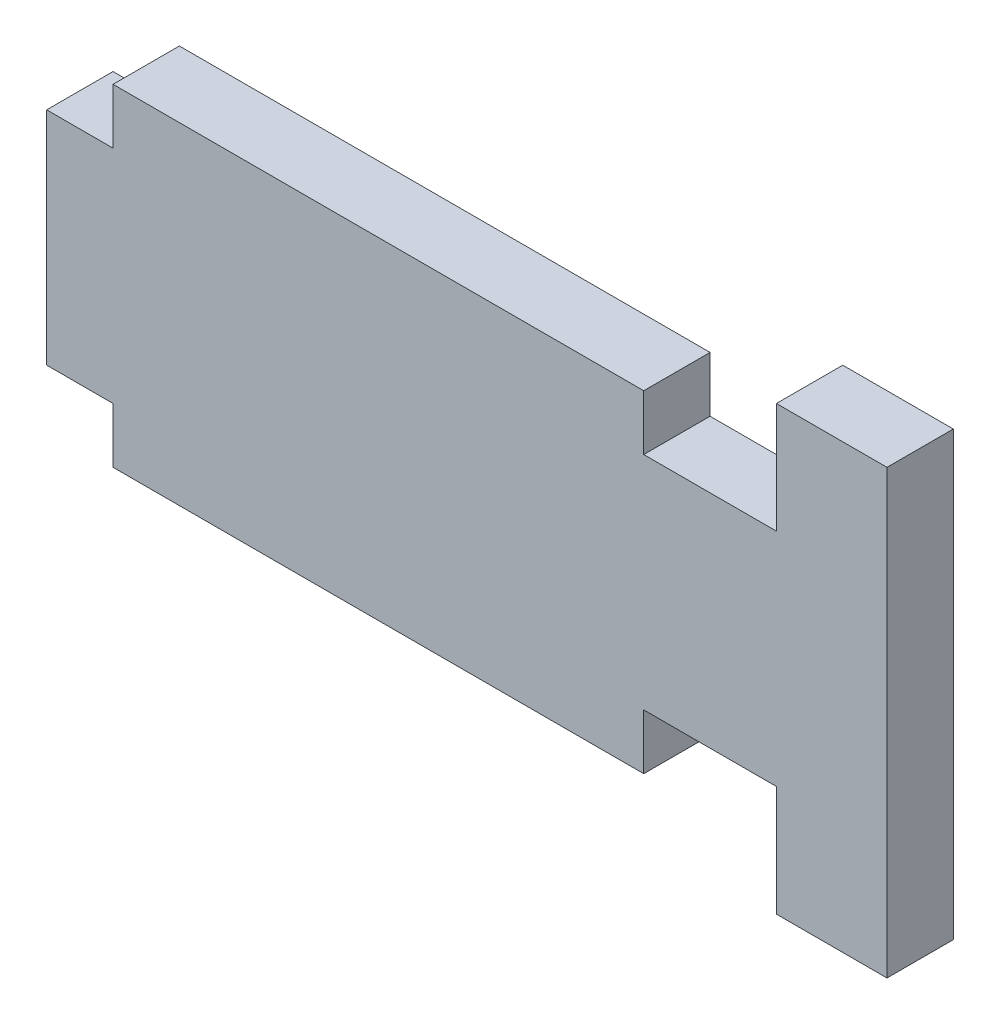
ISO-10303-21;
HEADER;
FILE_DESCRIPTION(('STEP AP214'),'2;1');
FILE_NAME('part.step','',(''),(''),'','','');
FILE_SCHEMA(('AUTOMOTIVE_DESIGN { 1 0 10303 214 1 1 1 1 }'));
ENDSEC;
DATA;
#1=APPLICATION_CONTEXT('core data for automotive mechanical design processes');
#2=APPLICATION_PROTOCOL_DEFINITION('international standard','automotive_design',2000,#1);
#3=PRODUCT_CONTEXT('',#1,'mechanical');
#4=PRODUCT('Part','Part','',(#3));
#5=PRODUCT_RELATED_PRODUCT_CATEGORY('part','',(#4));
#6=PRODUCT_DEFINITION_FORMATION('','',#4);
#7=PRODUCT_DEFINITION_CONTEXT('part definition',#1,'design');
#8=PRODUCT_DEFINITION('design','',#6,#7);
#9=PRODUCT_DEFINITION_SHAPE('','',#8);
#10=(LENGTH_UNIT() NAMED_UNIT(*) SI_UNIT(.MILLI.,.METRE.));
#11=(NAMED_UNIT(*) PLANE_ANGLE_UNIT() SI_UNIT($,.RADIAN.));
#12=(NAMED_UNIT(*) SI_UNIT($,.STERADIAN.) SOLID_ANGLE_UNIT());
#13=UNCERTAINTY_MEASURE_WITH_UNIT(LENGTH_MEASURE(1.E-05),#10,'distance_accuracy_value','');
#14=(GEOMETRIC_REPRESENTATION_CONTEXT(3) GLOBAL_UNCERTAINTY_ASSIGNED_CONTEXT((#13)) GLOBAL_UNIT_ASSIGNED_CONTEXT((#10,
#11,#12)) REPRESENTATION_CONTEXT('',''));
#15=CARTESIAN_POINT('',(0.,0.,0.));
#16=DIRECTION('',(0.,0.,1.));
#17=DIRECTION('',(1.,0.,0.));
#18=AXIS2_PLACEMENT_3D('',#15,#16,#17);
#19=CARTESIAN_POINT('',(0.,0.,0.));
#20=DIRECTION('',(0.,0.,1.));
#21=DIRECTION('',(1.,0.,0.));
#22=AXIS2_PLACEMENT_3D('',#19,#20,#21);
#23=PLANE('',#22);
#24=DIRECTION('',(1.,0.,0.));
#25=VECTOR('',#24,1.);
#26=CARTESIAN_POINT('',(0.,5.,0.));
#27=LINE('',#26,#25);
#28=CARTESIAN_POINT('',(-15.,5.,0.));
#29=VERTEX_POINT('',#28);
#30=CARTESIAN_POINT('',(-12.,5.,0.));
#31=VERTEX_POINT('',#30);
#32=EDGE_CURVE('E244',#29,#31,#27,.T.);
#33=ORIENTED_EDGE('',*,*,#32,.T.);
#34=DIRECTION('',(0.,1.,0.));
#35=VECTOR('',#34,1.);
#36=CARTESIAN_POINT('',(-12.,0.,0.));
#37=LINE('',#36,#35);
#38=CARTESIAN_POINT('',(-12.,7.5,0.));
#39=VERTEX_POINT('',#38);
#40=EDGE_CURVE('E256',#31,#39,#37,.T.);
#41=ORIENTED_EDGE('',*,*,#40,.T.);
#42=DIRECTION('',(1.,0.,0.));
#43=VECTOR('',#42,1.);
#44=CARTESIAN_POINT('',(0.,7.5,0.));
#45=LINE('',#44,#43);
#46=CARTESIAN_POINT('',(12.,7.5,0.));
#47=VERTEX_POINT('',#46);
#48=EDGE_CURVE('E279',#39,#47,#45,.T.);
#49=ORIENTED_EDGE('',*,*,#48,.T.);
#50=DIRECTION('',(0.,1.,0.));
#51=VECTOR('',#50,1.);
#52=CARTESIAN_POINT('',(12.,0.,0.));
#53=LINE('',#52,#51);
#54=CARTESIAN_POINT('',(12.,5.,0.));
#55=VERTEX_POINT('',#54);
#56=EDGE_CURVE('E231',#55,#47,#53,.T.);
#57=ORIENTED_EDGE('',*,*,#56,.F.);
#58=DIRECTION('',(-1.,0.,0.));
#59=VECTOR('',#58,1.);
#60=CARTESIAN_POINT('',(0.,5.00000000000001,0.));
#61=LINE('',#60,#59);
#62=CARTESIAN_POINT('',(18.,5.,0.));
#63=VERTEX_POINT('',#62);
#64=EDGE_CURVE('E277',#63,#55,#61,.T.);
#65=ORIENTED_EDGE('',*,*,#64,.F.);
#66=DIRECTION('',(0.,1.,0.));
#67=VECTOR('',#66,1.);
#68=CARTESIAN_POINT('',(18.,0.,0.));
#69=LINE('',#68,#67);
#70=CARTESIAN_POINT('',(18.,10.,0.));
#71=VERTEX_POINT('',#70);
#72=EDGE_CURVE('E268',#63,#71,#69,.T.);
#73=ORIENTED_EDGE('',*,*,#72,.T.);
#74=DIRECTION('',(1.,0.,0.));
#75=VECTOR('',#74,1.);
#76=CARTESIAN_POINT('',(0.,10.,0.));
#77=LINE('',#76,#75);
#78=CARTESIAN_POINT('',(23.,10.,0.));
#79=VERTEX_POINT('',#78);
#80=EDGE_CURVE('E274',#71,#79,#77,.T.);
#81=ORIENTED_EDGE('',*,*,#80,.T.);
#82=DIRECTION('',(0.,-1.,0.));
#83=VECTOR('',#82,1.);
#84=CARTESIAN_POINT('',(23.,0.,0.));
#85=LINE('',#84,#83);
#86=CARTESIAN_POINT('',(23.,-10.,0.));
#87=VERTEX_POINT('',#86);
#88=EDGE_CURVE('E271',#79,#87,#85,.T.);
#89=ORIENTED_EDGE('',*,*,#88,.T.);
#90=DIRECTION('',(-1.,0.,0.));
#91=VECTOR('',#90,1.);
#92=CARTESIAN_POINT('',(0.,-10.,0.));
#93=LINE('',#92,#91);
#94=CARTESIAN_POINT('',(18.,-10.,0.));
#95=VERTEX_POINT('',#94);
#96=EDGE_CURVE('E267',#87,#95,#93,.T.);
#97=ORIENTED_EDGE('',*,*,#96,.T.);
#98=CARTESIAN_POINT('',(18.,-5.,0.));
#99=VERTEX_POINT('',#98);
#100=EDGE_CURVE('E264',#95,#99,#69,.T.);
#101=ORIENTED_EDGE('',*,*,#100,.T.);
#102=DIRECTION('',(-1.,0.,0.));
#103=VECTOR('',#102,1.);
#104=CARTESIAN_POINT('',(0.,-4.99999999999999,0.));
#105=LINE('',#104,#103);
#106=CARTESIAN_POINT('',(12.,-5.,0.));
#107=VERTEX_POINT('',#106);
#108=EDGE_CURVE('E261',#99,#107,#105,.T.);
#109=ORIENTED_EDGE('',*,*,#108,.T.);
#110=CARTESIAN_POINT('',(12.,-7.5,0.));
#111=VERTEX_POINT('',#110);
#112=EDGE_CURVE('E258',#111,#107,#53,.T.);
#113=ORIENTED_EDGE('',*,*,#112,.F.);
#114=DIRECTION('',(1.,0.,0.));
#115=VECTOR('',#114,1.);
#116=CARTESIAN_POINT('',(0.,-7.5,0.));
#117=LINE('',#116,#115);
#118=CARTESIAN_POINT('',(-12.,-7.5,0.));
#119=VERTEX_POINT('',#118);
#120=EDGE_CURVE('E255',#119,#111,#117,.T.);
#121=ORIENTED_EDGE('',*,*,#120,.F.);
#122=CARTESIAN_POINT('',(-12.,-5.,0.));
#123=VERTEX_POINT('',#122);
#124=EDGE_CURVE('E252',#119,#123,#37,.T.);
#125=ORIENTED_EDGE('',*,*,#124,.T.);
#126=DIRECTION('',(1.,0.,0.));
#127=VECTOR('',#126,1.);
#128=CARTESIAN_POINT('',(0.,-5.,0.));
#129=LINE('',#128,#127);
#130=CARTESIAN_POINT('',(-15.,-5.,0.));
#131=VERTEX_POINT('',#130);
#132=EDGE_CURVE('E249',#131,#123,#129,.T.);
#133=ORIENTED_EDGE('',*,*,#132,.F.);
#134=DIRECTION('',(0.,1.,0.));
#135=VECTOR('',#134,1.);
#136=CARTESIAN_POINT('',(-15.,0.,0.));
#137=LINE('',#136,#135);
#138=EDGE_CURVE('E246',#131,#29,#137,.T.);
#139=ORIENTED_EDGE('',*,*,#138,.T.);
#140=EDGE_LOOP('',(#33,#41,#49,#57,#65,#73,#81,#89,#97,#101,#109,#113,#121,#125,#133,#139));
#141=FACE_BOUND('',#140,.T.);
#142=ADVANCED_FACE('F97',(#141),#23,.F.);
#143=CARTESIAN_POINT('',(0.,-5.,3.));
#144=DIRECTION('',(0.,1.,0.));
#145=DIRECTION('',(0.,0.,1.));
#146=AXIS2_PLACEMENT_3D('',#143,#144,#145);
#147=PLANE('',#146);
#148=ORIENTED_EDGE('',*,*,#132,.T.);
#149=DIRECTION('',(0.,0.,-1.));
#150=VECTOR('',#149,1.);
#151=CARTESIAN_POINT('',(-12.,-5.,3.));
#152=LINE('',#151,#150);
#153=CARTESIAN_POINT('',(-12.,-5.,3.));
#154=VERTEX_POINT('',#153);
#155=EDGE_CURVE('E303',#154,#123,#152,.T.);
#156=ORIENTED_EDGE('',*,*,#155,.F.);
#157=DIRECTION('',(1.,0.,0.));
#158=VECTOR('',#157,1.);
#159=CARTESIAN_POINT('',(0.,-5.,3.));
#160=LINE('',#159,#158);
#161=CARTESIAN_POINT('',(-15.,-5.,3.));
#162=VERTEX_POINT('',#161);
#163=EDGE_CURVE('E308',#162,#154,#160,.T.);
#164=ORIENTED_EDGE('',*,*,#163,.F.);
#165=DIRECTION('',(0.,0.,-1.));
#166=VECTOR('',#165,1.);
#167=CARTESIAN_POINT('',(-15.,-5.,3.));
#168=LINE('',#167,#166);
#169=EDGE_CURVE('E106',#162,#131,#168,.T.);
#170=ORIENTED_EDGE('',*,*,#169,.T.);
#171=EDGE_LOOP('',(#148,#156,#164,#170));
#172=FACE_BOUND('',#171,.T.);
#173=ADVANCED_FACE('F307',(#172),#147,.F.);
#174=CARTESIAN_POINT('',(-15.,0.,3.));
#175=DIRECTION('',(-1.,0.,0.));
#176=DIRECTION('',(0.,0.,1.));
#177=AXIS2_PLACEMENT_3D('',#174,#175,#176);
#178=PLANE('',#177);
#179=ORIENTED_EDGE('',*,*,#138,.F.);
#180=ORIENTED_EDGE('',*,*,#169,.F.);
#181=DIRECTION('',(0.,1.,0.));
#182=VECTOR('',#181,1.);
#183=CARTESIAN_POINT('',(-15.,0.,3.));
#184=LINE('',#183,#182);
#185=CARTESIAN_POINT('',(-15.,5.,3.));
#186=VERTEX_POINT('',#185);
#187=EDGE_CURVE('E317',#162,#186,#184,.T.);
#188=ORIENTED_EDGE('',*,*,#187,.T.);
#189=DIRECTION('',(0.,0.,-1.));
#190=VECTOR('',#189,1.);
#191=CARTESIAN_POINT('',(-15.,5.,3.));
#192=LINE('',#191,#190);
#193=EDGE_CURVE('E12',#186,#29,#192,.T.);
#194=ORIENTED_EDGE('',*,*,#193,.T.);
#195=EDGE_LOOP('',(#179,#180,#188,#194));
#196=FACE_BOUND('',#195,.T.);
#197=ADVANCED_FACE('F316',(#196),#178,.T.);
#198=CARTESIAN_POINT('',(0.,5.,3.));
#199=DIRECTION('',(0.,1.,0.));
#200=DIRECTION('',(0.,0.,1.));
#201=AXIS2_PLACEMENT_3D('',#198,#199,#200);
#202=PLANE('',#201);
#203=ORIENTED_EDGE('',*,*,#32,.F.);
#204=ORIENTED_EDGE('',*,*,#193,.F.);
#205=DIRECTION('',(1.,0.,0.));
#206=VECTOR('',#205,1.);
#207=CARTESIAN_POINT('',(0.,5.,3.));
#208=LINE('',#207,#206);
#209=CARTESIAN_POINT('',(-12.,5.,3.));
#210=VERTEX_POINT('',#209);
#211=EDGE_CURVE('E320',#186,#210,#208,.T.);
#212=ORIENTED_EDGE('',*,*,#211,.T.);
#213=DIRECTION('',(0.,0.,-1.));
#214=VECTOR('',#213,1.);
#215=CARTESIAN_POINT('',(-12.,5.,3.));
#216=LINE('',#215,#214);
#217=EDGE_CURVE('E114',#210,#31,#216,.T.);
#218=ORIENTED_EDGE('',*,*,#217,.T.);
#219=EDGE_LOOP('',(#203,#204,#212,#218));
#220=FACE_BOUND('',#219,.T.);
#221=ADVANCED_FACE('F99',(#220),#202,.T.);
#222=CARTESIAN_POINT('',(0.,0.,3.));
#223=DIRECTION('',(0.,0.,1.));
#224=DIRECTION('',(1.,0.,0.));
#225=AXIS2_PLACEMENT_3D('',#222,#223,#224);
#226=PLANE('',#225);
#227=ORIENTED_EDGE('',*,*,#163,.T.);
#228=DIRECTION('',(0.,1.,0.));
#229=VECTOR('',#228,1.);
#230=CARTESIAN_POINT('',(-12.,0.,3.));
#231=LINE('',#230,#229);
#232=CARTESIAN_POINT('',(-12.,-7.5,3.));
#233=VERTEX_POINT('',#232);
#234=EDGE_CURVE('E240',#233,#154,#231,.T.);
#235=ORIENTED_EDGE('',*,*,#234,.F.);
#236=DIRECTION('',(1.,0.,0.));
#237=VECTOR('',#236,1.);
#238=CARTESIAN_POINT('',(0.,-7.5,3.));
#239=LINE('',#238,#237);
#240=CARTESIAN_POINT('',(12.,-7.5,3.));
#241=VERTEX_POINT('',#240);
#242=EDGE_CURVE('E326',#233,#241,#239,.T.);
#243=ORIENTED_EDGE('',*,*,#242,.T.);
#244=DIRECTION('',(0.,1.,0.));
#245=VECTOR('',#244,1.);
#246=CARTESIAN_POINT('',(12.,0.,3.));
#247=LINE('',#246,#245);
#248=CARTESIAN_POINT('',(12.,-5.,3.));
#249=VERTEX_POINT('',#248);
#250=EDGE_CURVE('E226',#241,#249,#247,.T.);
#251=ORIENTED_EDGE('',*,*,#250,.T.);
#252=DIRECTION('',(-1.,0.,0.));
#253=VECTOR('',#252,1.);
#254=CARTESIAN_POINT('',(0.,-4.99999999999999,3.));
#255=LINE('',#254,#253);
#256=CARTESIAN_POINT('',(18.,-5.,3.));
#257=VERTEX_POINT('',#256);
#258=EDGE_CURVE('E328',#257,#249,#255,.T.);
#259=ORIENTED_EDGE('',*,*,#258,.F.);
#260=DIRECTION('',(0.,1.,0.));
#261=VECTOR('',#260,1.);
#262=CARTESIAN_POINT('',(18.,0.,3.));
#263=LINE('',#262,#261);
#264=CARTESIAN_POINT('',(18.,-10.,3.));
#265=VERTEX_POINT('',#264);
#266=EDGE_CURVE('E331',#265,#257,#263,.T.);
#267=ORIENTED_EDGE('',*,*,#266,.F.);
#268=DIRECTION('',(-1.,0.,0.));
#269=VECTOR('',#268,1.);
#270=CARTESIAN_POINT('',(0.,-10.,3.));
#271=LINE('',#270,#269);
#272=CARTESIAN_POINT('',(23.,-10.,3.));
#273=VERTEX_POINT('',#272);
#274=EDGE_CURVE('E334',#273,#265,#271,.T.);
#275=ORIENTED_EDGE('',*,*,#274,.F.);
#276=DIRECTION('',(0.,-1.,0.));
#277=VECTOR('',#276,1.);
#278=CARTESIAN_POINT('',(23.,0.,3.));
#279=LINE('',#278,#277);
#280=CARTESIAN_POINT('',(23.,10.,3.));
#281=VERTEX_POINT('',#280);
#282=EDGE_CURVE('E338',#281,#273,#279,.T.);
#283=ORIENTED_EDGE('',*,*,#282,.F.);
#284=DIRECTION('',(1.,0.,0.));
#285=VECTOR('',#284,1.);
#286=CARTESIAN_POINT('',(0.,10.,3.));
#287=LINE('',#286,#285);
#288=CARTESIAN_POINT('',(18.,10.,3.));
#289=VERTEX_POINT('',#288);
#290=EDGE_CURVE('E340',#289,#281,#287,.T.);
#291=ORIENTED_EDGE('',*,*,#290,.F.);
#292=CARTESIAN_POINT('',(18.,5.,3.));
#293=VERTEX_POINT('',#292);
#294=EDGE_CURVE('E335',#293,#289,#263,.T.);
#295=ORIENTED_EDGE('',*,*,#294,.F.);
#296=DIRECTION('',(-1.,0.,0.));
#297=VECTOR('',#296,1.);
#298=CARTESIAN_POINT('',(0.,5.00000000000001,3.));
#299=LINE('',#298,#297);
#300=CARTESIAN_POINT('',(12.,5.,3.));
#301=VERTEX_POINT('',#300);
#302=EDGE_CURVE('E221',#293,#301,#299,.T.);
#303=ORIENTED_EDGE('',*,*,#302,.T.);
#304=CARTESIAN_POINT('',(12.,7.5,3.));
#305=VERTEX_POINT('',#304);
#306=EDGE_CURVE('E212',#301,#305,#247,.T.);
#307=ORIENTED_EDGE('',*,*,#306,.T.);
#308=DIRECTION('',(1.,0.,0.));
#309=VECTOR('',#308,1.);
#310=CARTESIAN_POINT('',(0.,7.5,3.));
#311=LINE('',#310,#309);
#312=CARTESIAN_POINT('',(-12.,7.5,3.));
#313=VERTEX_POINT('',#312);
#314=EDGE_CURVE('E218',#313,#305,#311,.T.);
#315=ORIENTED_EDGE('',*,*,#314,.F.);
#316=EDGE_CURVE('E237',#210,#313,#231,.T.);
#317=ORIENTED_EDGE('',*,*,#316,.F.);
#318=ORIENTED_EDGE('',*,*,#211,.F.);
#319=ORIENTED_EDGE('',*,*,#187,.F.);
#320=EDGE_LOOP('',(#227,#235,#243,#251,#259,#267,#275,#283,#291,#295,#303,#307,#315,#317,#318,#319));
#321=FACE_BOUND('',#320,.T.);
#322=ADVANCED_FACE('F215',(#321),#226,.T.);
#323=CARTESIAN_POINT('',(-12.,0.,3.));
#324=DIRECTION('',(-1.,0.,0.));
#325=DIRECTION('',(0.,0.,1.));
#326=AXIS2_PLACEMENT_3D('',#323,#324,#325);
#327=PLANE('',#326);
#328=ORIENTED_EDGE('',*,*,#124,.F.);
#329=DIRECTION('',(0.,0.,-1.));
#330=VECTOR('',#329,1.);
#331=CARTESIAN_POINT('',(-12.,-7.5,3.));
#332=LINE('',#331,#330);
#333=EDGE_CURVE('E301',#233,#119,#332,.T.);
#334=ORIENTED_EDGE('',*,*,#333,.F.);
#335=ORIENTED_EDGE('',*,*,#234,.T.);
#336=ORIENTED_EDGE('',*,*,#155,.T.);
#337=EDGE_LOOP('',(#328,#334,#335,#336));
#338=FACE_BOUND('',#337,.T.);
#339=ADVANCED_FACE('F373',(#338),#327,.T.);
#340=CARTESIAN_POINT('',(0.,-7.5,3.));
#341=DIRECTION('',(0.,1.,0.));
#342=DIRECTION('',(0.,0.,1.));
#343=AXIS2_PLACEMENT_3D('',#340,#341,#342);
#344=PLANE('',#343);
#345=ORIENTED_EDGE('',*,*,#120,.T.);
#346=DIRECTION('',(0.,0.,-1.));
#347=VECTOR('',#346,1.);
#348=CARTESIAN_POINT('',(12.,-7.5,3.));
#349=LINE('',#348,#347);
#350=EDGE_CURVE('E298',#241,#111,#349,.T.);
#351=ORIENTED_EDGE('',*,*,#350,.F.);
#352=ORIENTED_EDGE('',*,*,#242,.F.);
#353=ORIENTED_EDGE('',*,*,#333,.T.);
#354=EDGE_LOOP('',(#345,#351,#352,#353));
#355=FACE_BOUND('',#354,.T.);
#356=ADVANCED_FACE('F381',(#355),#344,.F.);
#357=CARTESIAN_POINT('',(12.,0.,3.));
#358=DIRECTION('',(-1.,0.,0.));
#359=DIRECTION('',(0.,0.,1.));
#360=AXIS2_PLACEMENT_3D('',#357,#358,#359);
#361=PLANE('',#360);
#362=ORIENTED_EDGE('',*,*,#112,.T.);
#363=DIRECTION('',(0.,0.,-1.));
#364=VECTOR('',#363,1.);
#365=CARTESIAN_POINT('',(12.,-5.,3.));
#366=LINE('',#365,#364);
#367=EDGE_CURVE('E296',#249,#107,#366,.T.);
#368=ORIENTED_EDGE('',*,*,#367,.F.);
#369=ORIENTED_EDGE('',*,*,#250,.F.);
#370=ORIENTED_EDGE('',*,*,#350,.T.);
#371=EDGE_LOOP('',(#362,#368,#369,#370));
#372=FACE_BOUND('',#371,.T.);
#373=ADVANCED_FACE('F368',(#372),#361,.F.);
#374=CARTESIAN_POINT('',(0.,-4.99999999999999,3.));
#375=DIRECTION('',(0.,-1.,0.));
#376=DIRECTION('',(1.,0.,0.));
#377=AXIS2_PLACEMENT_3D('',#374,#375,#376);
#378=PLANE('',#377);
#379=ORIENTED_EDGE('',*,*,#108,.F.);
#380=DIRECTION('',(0.,0.,-1.));
#381=VECTOR('',#380,1.);
#382=CARTESIAN_POINT('',(18.,-5.,3.));
#383=LINE('',#382,#381);
#384=EDGE_CURVE('E294',#257,#99,#383,.T.);
#385=ORIENTED_EDGE('',*,*,#384,.F.);
#386=ORIENTED_EDGE('',*,*,#258,.T.);
#387=ORIENTED_EDGE('',*,*,#367,.T.);
#388=EDGE_LOOP('',(#379,#385,#386,#387));
#389=FACE_BOUND('',#388,.T.);
#390=ADVANCED_FACE('F448',(#389),#378,.T.);
#391=CARTESIAN_POINT('',(18.,0.,3.));
#392=DIRECTION('',(-1.,0.,0.));
#393=DIRECTION('',(0.,0.,1.));
#394=AXIS2_PLACEMENT_3D('',#391,#392,#393);
#395=PLANE('',#394);
#396=ORIENTED_EDGE('',*,*,#100,.F.);
#397=DIRECTION('',(0.,0.,-1.));
#398=VECTOR('',#397,1.);
#399=CARTESIAN_POINT('',(18.,-10.,3.));
#400=LINE('',#399,#398);
#401=EDGE_CURVE('E292',#265,#95,#400,.T.);
#402=ORIENTED_EDGE('',*,*,#401,.F.);
#403=ORIENTED_EDGE('',*,*,#266,.T.);
#404=ORIENTED_EDGE('',*,*,#384,.T.);
#405=EDGE_LOOP('',(#396,#402,#403,#404));
#406=FACE_BOUND('',#405,.T.);
#407=ADVANCED_FACE('F370',(#406),#395,.T.);
#408=CARTESIAN_POINT('',(0.,-10.,3.));
#409=DIRECTION('',(0.,-1.,0.));
#410=DIRECTION('',(0.,0.,-1.));
#411=AXIS2_PLACEMENT_3D('',#408,#409,#410);
#412=PLANE('',#411);
#413=ORIENTED_EDGE('',*,*,#96,.F.);
#414=DIRECTION('',(0.,0.,-1.));
#415=VECTOR('',#414,1.);
#416=CARTESIAN_POINT('',(23.,-10.,3.));
#417=LINE('',#416,#415);
#418=EDGE_CURVE('E290',#273,#87,#417,.T.);
#419=ORIENTED_EDGE('',*,*,#418,.F.);
#420=ORIENTED_EDGE('',*,*,#274,.T.);
#421=ORIENTED_EDGE('',*,*,#401,.T.);
#422=EDGE_LOOP('',(#413,#419,#420,#421));
#423=FACE_BOUND('',#422,.T.);
#424=ADVANCED_FACE('F430',(#423),#412,.T.);
#425=CARTESIAN_POINT('',(23.,0.,3.));
#426=DIRECTION('',(1.,0.,0.));
#427=DIRECTION('',(0.,0.,-1.));
#428=AXIS2_PLACEMENT_3D('',#425,#426,#427);
#429=PLANE('',#428);
#430=ORIENTED_EDGE('',*,*,#88,.F.);
#431=DIRECTION('',(0.,0.,-1.));
#432=VECTOR('',#431,1.);
#433=CARTESIAN_POINT('',(23.,10.,3.));
#434=LINE('',#433,#432);
#435=EDGE_CURVE('E288',#281,#79,#434,.T.);
#436=ORIENTED_EDGE('',*,*,#435,.F.);
#437=ORIENTED_EDGE('',*,*,#282,.T.);
#438=ORIENTED_EDGE('',*,*,#418,.T.);
#439=EDGE_LOOP('',(#430,#436,#437,#438));
#440=FACE_BOUND('',#439,.T.);
#441=ADVANCED_FACE('F354',(#440),#429,.T.);
#442=CARTESIAN_POINT('',(0.,10.,3.));
#443=DIRECTION('',(0.,1.,0.));
#444=DIRECTION('',(0.,0.,1.));
#445=AXIS2_PLACEMENT_3D('',#442,#443,#444);
#446=PLANE('',#445);
#447=ORIENTED_EDGE('',*,*,#80,.F.);
#448=DIRECTION('',(0.,0.,-1.));
#449=VECTOR('',#448,1.);
#450=CARTESIAN_POINT('',(18.,10.,3.));
#451=LINE('',#450,#449);
#452=EDGE_CURVE('E286',#289,#71,#451,.T.);
#453=ORIENTED_EDGE('',*,*,#452,.F.);
#454=ORIENTED_EDGE('',*,*,#290,.T.);
#455=ORIENTED_EDGE('',*,*,#435,.T.);
#456=EDGE_LOOP('',(#447,#453,#454,#455));
#457=FACE_BOUND('',#456,.T.);
#458=ADVANCED_FACE('F356',(#457),#446,.T.);
#459=ORIENTED_EDGE('',*,*,#72,.F.);
#460=DIRECTION('',(0.,0.,-1.));
#461=VECTOR('',#460,1.);
#462=CARTESIAN_POINT('',(18.,5.,3.));
#463=LINE('',#462,#461);
#464=EDGE_CURVE('E284',#293,#63,#463,.T.);
#465=ORIENTED_EDGE('',*,*,#464,.F.);
#466=ORIENTED_EDGE('',*,*,#294,.T.);
#467=ORIENTED_EDGE('',*,*,#452,.T.);
#468=EDGE_LOOP('',(#459,#465,#466,#467));
#469=FACE_BOUND('',#468,.T.);
#470=ADVANCED_FACE('F347',(#469),#395,.T.);
#471=CARTESIAN_POINT('',(0.,5.00000000000001,3.));
#472=DIRECTION('',(0.,-1.,0.));
#473=DIRECTION('',(1.,0.,0.));
#474=AXIS2_PLACEMENT_3D('',#471,#472,#473);
#475=PLANE('',#474);
#476=ORIENTED_EDGE('',*,*,#64,.T.);
#477=DIRECTION('',(0.,0.,-1.));
#478=VECTOR('',#477,1.);
#479=CARTESIAN_POINT('',(12.,5.,3.));
#480=LINE('',#479,#478);
#481=EDGE_CURVE('E234',#301,#55,#480,.T.);
#482=ORIENTED_EDGE('',*,*,#481,.F.);
#483=ORIENTED_EDGE('',*,*,#302,.F.);
#484=ORIENTED_EDGE('',*,*,#464,.T.);
#485=EDGE_LOOP('',(#476,#482,#483,#484));
#486=FACE_BOUND('',#485,.T.);
#487=ADVANCED_FACE('F360',(#486),#475,.F.);
#488=ORIENTED_EDGE('',*,*,#56,.T.);
#489=DIRECTION('',(0.,0.,-1.));
#490=VECTOR('',#489,1.);
#491=CARTESIAN_POINT('',(12.,7.5,3.));
#492=LINE('',#491,#490);
#493=EDGE_CURVE('E228',#305,#47,#492,.T.);
#494=ORIENTED_EDGE('',*,*,#493,.F.);
#495=ORIENTED_EDGE('',*,*,#306,.F.);
#496=ORIENTED_EDGE('',*,*,#481,.T.);
#497=EDGE_LOOP('',(#488,#494,#495,#496));
#498=FACE_BOUND('',#497,.T.);
#499=ADVANCED_FACE('F229',(#498),#361,.F.);
#500=CARTESIAN_POINT('',(0.,7.5,3.));
#501=DIRECTION('',(0.,1.,0.));
#502=DIRECTION('',(0.,0.,1.));
#503=AXIS2_PLACEMENT_3D('',#500,#501,#502);
#504=PLANE('',#503);
#505=ORIENTED_EDGE('',*,*,#48,.F.);
#506=DIRECTION('',(0.,0.,-1.));
#507=VECTOR('',#506,1.);
#508=CARTESIAN_POINT('',(-12.,7.5,3.));
#509=LINE('',#508,#507);
#510=EDGE_CURVE('E163',#313,#39,#509,.T.);
#511=ORIENTED_EDGE('',*,*,#510,.F.);
#512=ORIENTED_EDGE('',*,*,#314,.T.);
#513=ORIENTED_EDGE('',*,*,#493,.T.);
#514=EDGE_LOOP('',(#505,#511,#512,#513));
#515=FACE_BOUND('',#514,.T.);
#516=ADVANCED_FACE('F236',(#515),#504,.T.);
#517=ORIENTED_EDGE('',*,*,#40,.F.);
#518=ORIENTED_EDGE('',*,*,#217,.F.);
#519=ORIENTED_EDGE('',*,*,#316,.T.);
#520=ORIENTED_EDGE('',*,*,#510,.T.);
#521=EDGE_LOOP('',(#517,#518,#519,#520));
#522=FACE_BOUND('',#521,.T.);
#523=ADVANCED_FACE('F319',(#522),#327,.T.);
#524=CLOSED_SHELL('',(#142,#173,#197,#221,#322,#339,#356,#373,#390,#407,#424,#441,#458,#470,
#487,#499,#516,#523));
#525=MANIFOLD_SOLID_BREP('B2',#524);
#526=ADVANCED_BREP_SHAPE_REPRESENTATION('',(#18,#525),#14);
#527=SHAPE_DEFINITION_REPRESENTATION(#9,#526);
ENDSEC;
END-ISO-10303-21;
